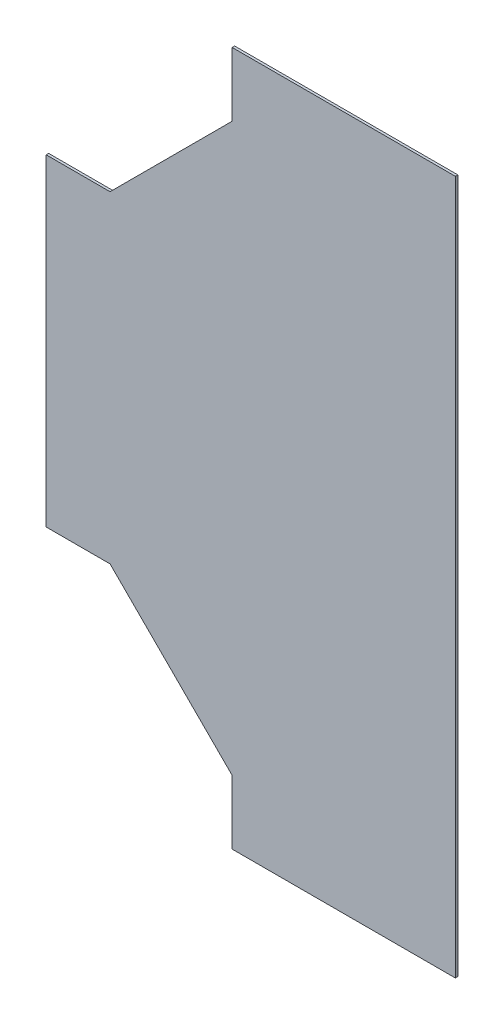
ISO-10303-21;
HEADER;
FILE_DESCRIPTION(('STEP AP214'),'2;1');
FILE_NAME('part.step','',(''),(''),'','','');
FILE_SCHEMA(('AUTOMOTIVE_DESIGN { 1 0 10303 214 1 1 1 1 }'));
ENDSEC;
DATA;
#1=APPLICATION_CONTEXT('core data for automotive mechanical design processes');
#2=APPLICATION_PROTOCOL_DEFINITION('international standard','automotive_design',2000,#1);
#3=PRODUCT_CONTEXT('',#1,'mechanical');
#4=PRODUCT('Part','Part','',(#3));
#5=PRODUCT_RELATED_PRODUCT_CATEGORY('part','',(#4));
#6=PRODUCT_DEFINITION_FORMATION('','',#4);
#7=PRODUCT_DEFINITION_CONTEXT('part definition',#1,'design');
#8=PRODUCT_DEFINITION('design','',#6,#7);
#9=PRODUCT_DEFINITION_SHAPE('','',#8);
#10=(LENGTH_UNIT() NAMED_UNIT(*) SI_UNIT(.MILLI.,.METRE.));
#11=(NAMED_UNIT(*) PLANE_ANGLE_UNIT() SI_UNIT($,.RADIAN.));
#12=(NAMED_UNIT(*) SI_UNIT($,.STERADIAN.) SOLID_ANGLE_UNIT());
#13=UNCERTAINTY_MEASURE_WITH_UNIT(LENGTH_MEASURE(1.E-05),#10,'distance_accuracy_value','');
#14=(GEOMETRIC_REPRESENTATION_CONTEXT(3) GLOBAL_UNCERTAINTY_ASSIGNED_CONTEXT((#13)) GLOBAL_UNIT_ASSIGNED_CONTEXT((#10,
#11,#12)) REPRESENTATION_CONTEXT('',''));
#15=CARTESIAN_POINT('',(0.,0.,0.));
#16=DIRECTION('',(0.,0.,1.));
#17=DIRECTION('',(1.,0.,0.));
#18=AXIS2_PLACEMENT_3D('',#15,#16,#17);
#19=CARTESIAN_POINT('',(209.55,355.6,2.54));
#20=DIRECTION('',(0.,-1.,0.));
#21=DIRECTION('',(0.,0.,-1.));
#22=AXIS2_PLACEMENT_3D('',#19,#20,#21);
#23=PLANE('',#22);
#24=DIRECTION('',(-1.,0.,0.));
#25=VECTOR('',#24,1.);
#26=CARTESIAN_POINT('',(209.55,355.6,0.));
#27=LINE('',#26,#25);
#28=CARTESIAN_POINT('',(209.55,355.6,0.));
#29=VERTEX_POINT('',#28);
#30=CARTESIAN_POINT('',(-19.05,355.6,0.));
#31=VERTEX_POINT('',#30);
#32=EDGE_CURVE('E149',#29,#31,#27,.T.);
#33=ORIENTED_EDGE('',*,*,#32,.T.);
#34=DIRECTION('',(0.,0.,1.));
#35=VECTOR('',#34,1.);
#36=CARTESIAN_POINT('',(-19.05,355.6,0.));
#37=LINE('',#36,#35);
#38=CARTESIAN_POINT('',(-19.05,355.6,2.54));
#39=VERTEX_POINT('',#38);
#40=EDGE_CURVE('E156',#31,#39,#37,.T.);
#41=ORIENTED_EDGE('',*,*,#40,.T.);
#42=DIRECTION('',(-1.,0.,0.));
#43=VECTOR('',#42,1.);
#44=CARTESIAN_POINT('',(209.55,355.6,2.54));
#45=LINE('',#44,#43);
#46=CARTESIAN_POINT('',(209.55,355.6,2.54));
#47=VERTEX_POINT('',#46);
#48=EDGE_CURVE('E161',#47,#39,#45,.T.);
#49=ORIENTED_EDGE('',*,*,#48,.F.);
#50=DIRECTION('',(0.,0.,-1.));
#51=VECTOR('',#50,1.);
#52=CARTESIAN_POINT('',(209.55,355.6,2.54));
#53=LINE('',#52,#51);
#54=EDGE_CURVE('E53',#47,#29,#53,.T.);
#55=ORIENTED_EDGE('',*,*,#54,.T.);
#56=EDGE_LOOP('',(#33,#41,#49,#55));
#57=FACE_BOUND('',#56,.T.);
#58=ADVANCED_FACE('F45',(#57),#23,.F.);
#59=CARTESIAN_POINT('',(-209.55,-355.6,2.54));
#60=DIRECTION('',(1.,0.,0.));
#61=DIRECTION('',(0.,0.,-1.));
#62=AXIS2_PLACEMENT_3D('',#59,#60,#61);
#63=PLANE('',#62);
#64=DIRECTION('',(0.,-1.,0.));
#65=VECTOR('',#64,1.);
#66=CARTESIAN_POINT('',(-209.55,-355.6,2.54));
#67=LINE('',#66,#65);
#68=CARTESIAN_POINT('',(-209.55,165.1,2.54));
#69=VERTEX_POINT('',#68);
#70=CARTESIAN_POINT('',(-209.55,-165.1,2.54));
#71=VERTEX_POINT('',#70);
#72=EDGE_CURVE('E140',#69,#71,#67,.T.);
#73=ORIENTED_EDGE('',*,*,#72,.F.);
#74=DIRECTION('',(0.,0.,1.));
#75=VECTOR('',#74,1.);
#76=CARTESIAN_POINT('',(-209.55,165.1,0.));
#77=LINE('',#76,#75);
#78=CARTESIAN_POINT('',(-209.55,165.1,0.));
#79=VERTEX_POINT('',#78);
#80=EDGE_CURVE('E125',#79,#69,#77,.T.);
#81=ORIENTED_EDGE('',*,*,#80,.F.);
#82=DIRECTION('',(0.,-1.,0.));
#83=VECTOR('',#82,1.);
#84=CARTESIAN_POINT('',(-209.55,-355.6,0.));
#85=LINE('',#84,#83);
#86=CARTESIAN_POINT('',(-209.55,-165.1,0.));
#87=VERTEX_POINT('',#86);
#88=EDGE_CURVE('E138',#79,#87,#85,.T.);
#89=ORIENTED_EDGE('',*,*,#88,.T.);
#90=DIRECTION('',(0.,0.,1.));
#91=VECTOR('',#90,1.);
#92=CARTESIAN_POINT('',(-209.55,-165.1,0.));
#93=LINE('',#92,#91);
#94=EDGE_CURVE('E206',#87,#71,#93,.T.);
#95=ORIENTED_EDGE('',*,*,#94,.T.);
#96=EDGE_LOOP('',(#73,#81,#89,#95));
#97=FACE_BOUND('',#96,.T.);
#98=ADVANCED_FACE('F136',(#97),#63,.F.);
#99=CARTESIAN_POINT('',(209.55,-355.6,2.54));
#100=DIRECTION('',(0.,1.,0.));
#101=DIRECTION('',(0.,0.,1.));
#102=AXIS2_PLACEMENT_3D('',#99,#100,#101);
#103=PLANE('',#102);
#104=DIRECTION('',(1.,0.,0.));
#105=VECTOR('',#104,1.);
#106=CARTESIAN_POINT('',(209.55,-355.6,2.54));
#107=LINE('',#106,#105);
#108=CARTESIAN_POINT('',(-19.05,-355.6,2.54));
#109=VERTEX_POINT('',#108);
#110=CARTESIAN_POINT('',(209.55,-355.6,2.54));
#111=VERTEX_POINT('',#110);
#112=EDGE_CURVE('E170',#109,#111,#107,.T.);
#113=ORIENTED_EDGE('',*,*,#112,.F.);
#114=DIRECTION('',(0.,0.,1.));
#115=VECTOR('',#114,1.);
#116=CARTESIAN_POINT('',(-19.05,-355.6,0.));
#117=LINE('',#116,#115);
#118=CARTESIAN_POINT('',(-19.05,-355.6,0.));
#119=VERTEX_POINT('',#118);
#120=EDGE_CURVE('E203',#119,#109,#117,.T.);
#121=ORIENTED_EDGE('',*,*,#120,.F.);
#122=DIRECTION('',(1.,0.,0.));
#123=VECTOR('',#122,1.);
#124=CARTESIAN_POINT('',(209.55,-355.6,0.));
#125=LINE('',#124,#123);
#126=CARTESIAN_POINT('',(209.55,-355.6,0.));
#127=VERTEX_POINT('',#126);
#128=EDGE_CURVE('E148',#119,#127,#125,.T.);
#129=ORIENTED_EDGE('',*,*,#128,.T.);
#130=DIRECTION('',(0.,0.,-1.));
#131=VECTOR('',#130,1.);
#132=CARTESIAN_POINT('',(209.55,-355.6,2.54));
#133=LINE('',#132,#131);
#134=EDGE_CURVE('E11',#111,#127,#133,.T.);
#135=ORIENTED_EDGE('',*,*,#134,.F.);
#136=EDGE_LOOP('',(#113,#121,#129,#135));
#137=FACE_BOUND('',#136,.T.);
#138=ADVANCED_FACE('F254',(#137),#103,.F.);
#139=CARTESIAN_POINT('',(209.55,-355.6,2.54));
#140=DIRECTION('',(-1.,0.,0.));
#141=DIRECTION('',(0.,0.,1.));
#142=AXIS2_PLACEMENT_3D('',#139,#140,#141);
#143=PLANE('',#142);
#144=DIRECTION('',(0.,1.,0.));
#145=VECTOR('',#144,1.);
#146=CARTESIAN_POINT('',(209.55,-355.6,0.));
#147=LINE('',#146,#145);
#148=EDGE_CURVE('E153',#127,#29,#147,.T.);
#149=ORIENTED_EDGE('',*,*,#148,.T.);
#150=ORIENTED_EDGE('',*,*,#54,.F.);
#151=DIRECTION('',(0.,1.,0.));
#152=VECTOR('',#151,1.);
#153=CARTESIAN_POINT('',(209.55,-355.6,2.54));
#154=LINE('',#153,#152);
#155=EDGE_CURVE('E164',#111,#47,#154,.T.);
#156=ORIENTED_EDGE('',*,*,#155,.F.);
#157=ORIENTED_EDGE('',*,*,#134,.T.);
#158=EDGE_LOOP('',(#149,#150,#156,#157));
#159=FACE_BOUND('',#158,.T.);
#160=ADVANCED_FACE('F257',(#159),#143,.F.);
#161=CARTESIAN_POINT('',(0.,0.,2.54));
#162=DIRECTION('',(0.,0.,-1.));
#163=DIRECTION('',(-1.,0.,0.));
#164=AXIS2_PLACEMENT_3D('',#161,#162,#163);
#165=PLANE('',#164);
#166=ORIENTED_EDGE('',*,*,#48,.T.);
#167=DIRECTION('',(0.,1.,0.));
#168=VECTOR('',#167,1.);
#169=CARTESIAN_POINT('',(-19.05,355.6,2.54));
#170=LINE('',#169,#168);
#171=CARTESIAN_POINT('',(-19.0499999999999,290.162700549529,2.54));
#172=VERTEX_POINT('',#171);
#173=EDGE_CURVE('E131',#172,#39,#170,.T.);
#174=ORIENTED_EDGE('',*,*,#173,.F.);
#175=DIRECTION('',(0.707106781186549,0.707106781186546,0.));
#176=VECTOR('',#175,1.);
#177=CARTESIAN_POINT('',(-144.112700549529,165.1,2.54));
#178=LINE('',#177,#176);
#179=CARTESIAN_POINT('',(-144.112700549529,165.1,2.54));
#180=VERTEX_POINT('',#179);
#181=EDGE_CURVE('E224',#180,#172,#178,.T.);
#182=ORIENTED_EDGE('',*,*,#181,.F.);
#183=DIRECTION('',(1.,0.,0.));
#184=VECTOR('',#183,1.);
#185=CARTESIAN_POINT('',(-144.112700549529,165.1,2.54));
#186=LINE('',#185,#184);
#187=EDGE_CURVE('E196',#69,#180,#186,.T.);
#188=ORIENTED_EDGE('',*,*,#187,.F.);
#189=ORIENTED_EDGE('',*,*,#72,.T.);
#190=DIRECTION('',(-1.,0.,0.));
#191=VECTOR('',#190,1.);
#192=CARTESIAN_POINT('',(-144.112700549529,-165.1,2.54));
#193=LINE('',#192,#191);
#194=CARTESIAN_POINT('',(-144.112700549529,-165.1,2.54));
#195=VERTEX_POINT('',#194);
#196=EDGE_CURVE('E185',#195,#71,#193,.T.);
#197=ORIENTED_EDGE('',*,*,#196,.F.);
#198=DIRECTION('',(-0.707106781186549,0.707106781186546,0.));
#199=VECTOR('',#198,1.);
#200=CARTESIAN_POINT('',(-144.112700549529,-165.1,2.54));
#201=LINE('',#200,#199);
#202=CARTESIAN_POINT('',(-19.0499999999999,-290.162700549529,2.54));
#203=VERTEX_POINT('',#202);
#204=EDGE_CURVE('E197',#203,#195,#201,.T.);
#205=ORIENTED_EDGE('',*,*,#204,.F.);
#206=DIRECTION('',(0.,1.,0.));
#207=VECTOR('',#206,1.);
#208=CARTESIAN_POINT('',(-19.05,-355.6,2.54));
#209=LINE('',#208,#207);
#210=EDGE_CURVE('E192',#109,#203,#209,.T.);
#211=ORIENTED_EDGE('',*,*,#210,.F.);
#212=ORIENTED_EDGE('',*,*,#112,.T.);
#213=ORIENTED_EDGE('',*,*,#155,.T.);
#214=EDGE_LOOP('',(#166,#174,#182,#188,#189,#197,#205,#211,#212,#213));
#215=FACE_BOUND('',#214,.T.);
#216=ADVANCED_FACE('F237',(#215),#165,.F.);
#217=CARTESIAN_POINT('',(0.,0.,0.));
#218=DIRECTION('',(0.,0.,-1.));
#219=DIRECTION('',(-1.,0.,0.));
#220=AXIS2_PLACEMENT_3D('',#217,#218,#219);
#221=PLANE('',#220);
#222=DIRECTION('',(0.,1.,0.));
#223=VECTOR('',#222,1.);
#224=CARTESIAN_POINT('',(-19.05,355.6,0.));
#225=LINE('',#224,#223);
#226=CARTESIAN_POINT('',(-19.0499999999999,290.162700549529,0.));
#227=VERTEX_POINT('',#226);
#228=EDGE_CURVE('E142',#227,#31,#225,.T.);
#229=ORIENTED_EDGE('',*,*,#228,.T.);
#230=ORIENTED_EDGE('',*,*,#32,.F.);
#231=ORIENTED_EDGE('',*,*,#148,.F.);
#232=ORIENTED_EDGE('',*,*,#128,.F.);
#233=DIRECTION('',(0.,1.,0.));
#234=VECTOR('',#233,1.);
#235=CARTESIAN_POINT('',(-19.05,-355.6,0.));
#236=LINE('',#235,#234);
#237=CARTESIAN_POINT('',(-19.0499999999999,-290.162700549529,0.));
#238=VERTEX_POINT('',#237);
#239=EDGE_CURVE('E181',#119,#238,#236,.T.);
#240=ORIENTED_EDGE('',*,*,#239,.T.);
#241=DIRECTION('',(-0.707106781186549,0.707106781186546,0.));
#242=VECTOR('',#241,1.);
#243=CARTESIAN_POINT('',(-144.112700549529,-165.1,0.));
#244=LINE('',#243,#242);
#245=CARTESIAN_POINT('',(-144.112700549529,-165.1,0.));
#246=VERTEX_POINT('',#245);
#247=EDGE_CURVE('E186',#238,#246,#244,.T.);
#248=ORIENTED_EDGE('',*,*,#247,.T.);
#249=DIRECTION('',(-1.,0.,0.));
#250=VECTOR('',#249,1.);
#251=CARTESIAN_POINT('',(-144.112700549529,-165.1,0.));
#252=LINE('',#251,#250);
#253=EDGE_CURVE('E68',#246,#87,#252,.T.);
#254=ORIENTED_EDGE('',*,*,#253,.T.);
#255=ORIENTED_EDGE('',*,*,#88,.F.);
#256=DIRECTION('',(1.,0.,0.));
#257=VECTOR('',#256,1.);
#258=CARTESIAN_POINT('',(-144.112700549529,165.1,0.));
#259=LINE('',#258,#257);
#260=CARTESIAN_POINT('',(-144.112700549529,165.1,0.));
#261=VERTEX_POINT('',#260);
#262=EDGE_CURVE('E121',#79,#261,#259,.T.);
#263=ORIENTED_EDGE('',*,*,#262,.T.);
#264=DIRECTION('',(0.707106781186549,0.707106781186546,0.));
#265=VECTOR('',#264,1.);
#266=CARTESIAN_POINT('',(-144.112700549529,165.1,0.));
#267=LINE('',#266,#265);
#268=EDGE_CURVE('E60',#261,#227,#267,.T.);
#269=ORIENTED_EDGE('',*,*,#268,.T.);
#270=EDGE_LOOP('',(#229,#230,#231,#232,#240,#248,#254,#255,#263,#269));
#271=FACE_BOUND('',#270,.T.);
#272=ADVANCED_FACE('F145',(#271),#221,.T.);
#273=CARTESIAN_POINT('',(-19.05,-355.6,0.));
#274=DIRECTION('',(1.,0.,0.));
#275=DIRECTION('',(0.,1.,0.));
#276=AXIS2_PLACEMENT_3D('',#273,#274,#275);
#277=PLANE('',#276);
#278=ORIENTED_EDGE('',*,*,#210,.T.);
#279=DIRECTION('',(0.,0.,1.));
#280=VECTOR('',#279,1.);
#281=CARTESIAN_POINT('',(-19.0499999999999,-290.162700549529,0.));
#282=LINE('',#281,#280);
#283=EDGE_CURVE('E191',#238,#203,#282,.T.);
#284=ORIENTED_EDGE('',*,*,#283,.F.);
#285=ORIENTED_EDGE('',*,*,#239,.F.);
#286=ORIENTED_EDGE('',*,*,#120,.T.);
#287=EDGE_LOOP('',(#278,#284,#285,#286));
#288=FACE_BOUND('',#287,.T.);
#289=ADVANCED_FACE('F249',(#288),#277,.F.);
#290=CARTESIAN_POINT('',(-144.112700549529,-165.1,0.));
#291=DIRECTION('',(0.,1.,0.));
#292=DIRECTION('',(0.,0.,1.));
#293=AXIS2_PLACEMENT_3D('',#290,#291,#292);
#294=PLANE('',#293);
#295=ORIENTED_EDGE('',*,*,#196,.T.);
#296=ORIENTED_EDGE('',*,*,#94,.F.);
#297=ORIENTED_EDGE('',*,*,#253,.F.);
#298=DIRECTION('',(0.,0.,1.));
#299=VECTOR('',#298,1.);
#300=CARTESIAN_POINT('',(-144.112700549529,-165.1,0.));
#301=LINE('',#300,#299);
#302=EDGE_CURVE('E209',#246,#195,#301,.T.);
#303=ORIENTED_EDGE('',*,*,#302,.T.);
#304=EDGE_LOOP('',(#295,#296,#297,#303));
#305=FACE_BOUND('',#304,.T.);
#306=ADVANCED_FACE('F244',(#305),#294,.F.);
#307=CARTESIAN_POINT('',(-144.112700549529,-165.1,0.));
#308=DIRECTION('',(0.707106781186546,0.707106781186549,0.));
#309=DIRECTION('',(-0.707106781186549,0.707106781186546,0.));
#310=AXIS2_PLACEMENT_3D('',#307,#308,#309);
#311=PLANE('',#310);
#312=ORIENTED_EDGE('',*,*,#204,.T.);
#313=ORIENTED_EDGE('',*,*,#302,.F.);
#314=ORIENTED_EDGE('',*,*,#247,.F.);
#315=ORIENTED_EDGE('',*,*,#283,.T.);
#316=EDGE_LOOP('',(#312,#313,#314,#315));
#317=FACE_BOUND('',#316,.T.);
#318=ADVANCED_FACE('F247',(#317),#311,.F.);
#319=CARTESIAN_POINT('',(-19.05,355.6,0.));
#320=DIRECTION('',(1.,0.,0.));
#321=DIRECTION('',(0.,1.,0.));
#322=AXIS2_PLACEMENT_3D('',#319,#320,#321);
#323=PLANE('',#322);
#324=ORIENTED_EDGE('',*,*,#173,.T.);
#325=ORIENTED_EDGE('',*,*,#40,.F.);
#326=ORIENTED_EDGE('',*,*,#228,.F.);
#327=DIRECTION('',(0.,0.,1.));
#328=VECTOR('',#327,1.);
#329=CARTESIAN_POINT('',(-19.0499999999999,290.162700549529,0.));
#330=LINE('',#329,#328);
#331=EDGE_CURVE('E216',#227,#172,#330,.T.);
#332=ORIENTED_EDGE('',*,*,#331,.T.);
#333=EDGE_LOOP('',(#324,#325,#326,#332));
#334=FACE_BOUND('',#333,.T.);
#335=ADVANCED_FACE('F239',(#334),#323,.F.);
#336=CARTESIAN_POINT('',(-144.112700549529,165.1,0.));
#337=DIRECTION('',(0.707106781186546,-0.707106781186549,0.));
#338=DIRECTION('',(0.707106781186549,0.707106781186546,0.));
#339=AXIS2_PLACEMENT_3D('',#336,#337,#338);
#340=PLANE('',#339);
#341=ORIENTED_EDGE('',*,*,#181,.T.);
#342=ORIENTED_EDGE('',*,*,#331,.F.);
#343=ORIENTED_EDGE('',*,*,#268,.F.);
#344=DIRECTION('',(0.,0.,1.));
#345=VECTOR('',#344,1.);
#346=CARTESIAN_POINT('',(-144.112700549529,165.1,0.));
#347=LINE('',#346,#345);
#348=EDGE_CURVE('E127',#261,#180,#347,.T.);
#349=ORIENTED_EDGE('',*,*,#348,.T.);
#350=EDGE_LOOP('',(#341,#342,#343,#349));
#351=FACE_BOUND('',#350,.T.);
#352=ADVANCED_FACE('F240',(#351),#340,.F.);
#353=CARTESIAN_POINT('',(-144.112700549529,165.1,0.));
#354=DIRECTION('',(0.,-1.,0.));
#355=DIRECTION('',(0.,0.,-1.));
#356=AXIS2_PLACEMENT_3D('',#353,#354,#355);
#357=PLANE('',#356);
#358=ORIENTED_EDGE('',*,*,#187,.T.);
#359=ORIENTED_EDGE('',*,*,#348,.F.);
#360=ORIENTED_EDGE('',*,*,#262,.F.);
#361=ORIENTED_EDGE('',*,*,#80,.T.);
#362=EDGE_LOOP('',(#358,#359,#360,#361));
#363=FACE_BOUND('',#362,.T.);
#364=ADVANCED_FACE('F124',(#363),#357,.F.);
#365=CLOSED_SHELL('',(#58,#98,#138,#160,#216,#272,#289,#306,#318,#335,#352,#364));
#366=MANIFOLD_SOLID_BREP('B2',#365);
#367=ADVANCED_BREP_SHAPE_REPRESENTATION('',(#18,#366),#14);
#368=SHAPE_DEFINITION_REPRESENTATION(#9,#367);
ENDSEC;
END-ISO-10303-21;
